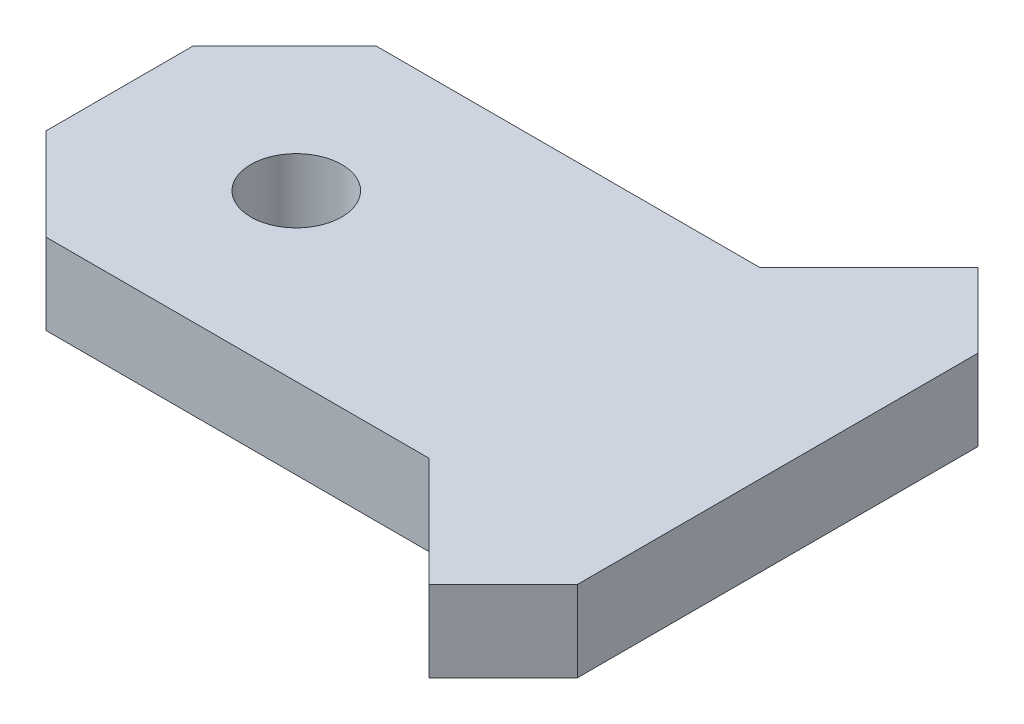
ISO-10303-21;
HEADER;
FILE_DESCRIPTION(('STEP AP214'),'2;1');
FILE_NAME('part.step','',(''),(''),'','','');
FILE_SCHEMA(('AUTOMOTIVE_DESIGN { 1 0 10303 214 1 1 1 1 }'));
ENDSEC;
DATA;
#1=APPLICATION_CONTEXT('core data for automotive mechanical design processes');
#2=APPLICATION_PROTOCOL_DEFINITION('international standard','automotive_design',2000,#1);
#3=PRODUCT_CONTEXT('',#1,'mechanical');
#4=PRODUCT('Part','Part','',(#3));
#5=PRODUCT_RELATED_PRODUCT_CATEGORY('part','',(#4));
#6=PRODUCT_DEFINITION_FORMATION('','',#4);
#7=PRODUCT_DEFINITION_CONTEXT('part definition',#1,'design');
#8=PRODUCT_DEFINITION('design','',#6,#7);
#9=PRODUCT_DEFINITION_SHAPE('','',#8);
#10=(LENGTH_UNIT() NAMED_UNIT(*) SI_UNIT(.MILLI.,.METRE.));
#11=(NAMED_UNIT(*) PLANE_ANGLE_UNIT() SI_UNIT($,.RADIAN.));
#12=(NAMED_UNIT(*) SI_UNIT($,.STERADIAN.) SOLID_ANGLE_UNIT());
#13=UNCERTAINTY_MEASURE_WITH_UNIT(LENGTH_MEASURE(1.E-05),#10,'distance_accuracy_value','');
#14=(GEOMETRIC_REPRESENTATION_CONTEXT(3) GLOBAL_UNCERTAINTY_ASSIGNED_CONTEXT((#13)) GLOBAL_UNIT_ASSIGNED_CONTEXT((#10,
#11,#12)) REPRESENTATION_CONTEXT('',''));
#15=CARTESIAN_POINT('',(0.,0.,0.));
#16=DIRECTION('',(0.,0.,1.));
#17=DIRECTION('',(1.,0.,0.));
#18=AXIS2_PLACEMENT_3D('',#15,#16,#17);
#19=CARTESIAN_POINT('',(0.,4.,0.));
#20=DIRECTION('',(0.,1.,0.));
#21=DIRECTION('',(0.,0.,1.));
#22=AXIS2_PLACEMENT_3D('',#19,#20,#21);
#23=PLANE('',#22);
#24=DIRECTION('',(-0.707106781186549,0.,0.707106781186546));
#25=VECTOR('',#24,1.);
#26=CARTESIAN_POINT('',(0.,4.,-3.62436867076458));
#27=LINE('',#26,#25);
#28=CARTESIAN_POINT('',(4.54796897923543,4.,-8.17233765));
#29=VERTEX_POINT('',#28);
#30=CARTESIAN_POINT('',(0.,4.,-3.62436867076458));
#31=VERTEX_POINT('',#30);
#32=EDGE_CURVE('E168',#29,#31,#27,.T.);
#33=ORIENTED_EDGE('',*,*,#32,.T.);
#34=DIRECTION('',(0.,0.,1.));
#35=VECTOR('',#34,1.);
#36=CARTESIAN_POINT('',(0.,4.,-3.62436867076458));
#37=LINE('',#36,#35);
#38=CARTESIAN_POINT('',(0.,4.,3.62436867076458));
#39=VERTEX_POINT('',#38);
#40=EDGE_CURVE('E104',#31,#39,#37,.T.);
#41=ORIENTED_EDGE('',*,*,#40,.T.);
#42=DIRECTION('',(0.707106781186548,0.,0.707106781186548));
#43=VECTOR('',#42,1.);
#44=CARTESIAN_POINT('',(0.,4.,3.62436867076458));
#45=LINE('',#44,#43);
#46=CARTESIAN_POINT('',(4.54796897923542,4.,8.17233765000001));
#47=VERTEX_POINT('',#46);
#48=EDGE_CURVE('E189',#39,#47,#45,.T.);
#49=ORIENTED_EDGE('',*,*,#48,.T.);
#50=DIRECTION('',(1.,0.,0.));
#51=VECTOR('',#50,1.);
#52=CARTESIAN_POINT('',(4.54796897923542,4.,8.17233765000001));
#53=LINE('',#52,#51);
#54=CARTESIAN_POINT('',(23.47528137,4.,8.17233765000001));
#55=VERTEX_POINT('',#54);
#56=EDGE_CURVE('E207',#47,#55,#53,.T.);
#57=ORIENTED_EDGE('',*,*,#56,.T.);
#58=DIRECTION('',(0.707106781186609,0.,0.707106781186486));
#59=VECTOR('',#58,1.);
#60=CARTESIAN_POINT('',(23.47528137,4.,8.17233765000001));
#61=LINE('',#60,#59);
#62=CARTESIAN_POINT('',(28.8793939163394,4.,13.5764501963394));
#63=VERTEX_POINT('',#62);
#64=EDGE_CURVE('E204',#55,#63,#61,.T.);
#65=ORIENTED_EDGE('',*,*,#64,.T.);
#66=DIRECTION('',(0.707106781186549,0.,-0.707106781186546));
#67=VECTOR('',#66,1.);
#68=CARTESIAN_POINT('',(28.8793939163394,4.,13.5764501963394));
#69=LINE('',#68,#67);
#70=CARTESIAN_POINT('',(32.5563491785094,4.,9.89949493416935));
#71=VERTEX_POINT('',#70);
#72=EDGE_CURVE('E206',#63,#71,#69,.T.);
#73=ORIENTED_EDGE('',*,*,#72,.T.);
#74=DIRECTION('',(0.,0.,-1.));
#75=VECTOR('',#74,1.);
#76=CARTESIAN_POINT('',(32.5563491785094,4.,9.89949493416935));
#77=LINE('',#76,#75);
#78=CARTESIAN_POINT('',(32.5563491785094,4.,-9.89949493416932));
#79=VERTEX_POINT('',#78);
#80=EDGE_CURVE('E129',#71,#79,#77,.T.);
#81=ORIENTED_EDGE('',*,*,#80,.T.);
#82=DIRECTION('',(-0.707106781186549,0.,-0.707106781186546));
#83=VECTOR('',#82,1.);
#84=CARTESIAN_POINT('',(32.5563491785094,4.,-9.89949493416932));
#85=LINE('',#84,#83);
#86=CARTESIAN_POINT('',(28.8793939163393,4.,-13.5764501963394));
#87=VERTEX_POINT('',#86);
#88=EDGE_CURVE('E123',#79,#87,#85,.T.);
#89=ORIENTED_EDGE('',*,*,#88,.T.);
#90=DIRECTION('',(-0.707106781186546,0.,0.707106781186549));
#91=VECTOR('',#90,1.);
#92=CARTESIAN_POINT('',(28.8793939163393,4.,-13.5764501963394));
#93=LINE('',#92,#91);
#94=CARTESIAN_POINT('',(23.47528137,4.,-8.17233765));
#95=VERTEX_POINT('',#94);
#96=EDGE_CURVE('E127',#87,#95,#93,.T.);
#97=ORIENTED_EDGE('',*,*,#96,.T.);
#98=DIRECTION('',(-1.,0.,0.));
#99=VECTOR('',#98,1.);
#100=CARTESIAN_POINT('',(4.54796897923543,4.,-8.17233765));
#101=LINE('',#100,#99);
#102=EDGE_CURVE('E56',#95,#29,#101,.T.);
#103=ORIENTED_EDGE('',*,*,#102,.T.);
#104=EDGE_LOOP('',(#33,#41,#49,#57,#65,#73,#81,#89,#97,#103));
#105=FACE_BOUND('',#104,.T.);
#106=CARTESIAN_POINT('',(8.75,4.,0.));
#107=DIRECTION('',(0.,1.,0.));
#108=DIRECTION('',(0.,0.,1.));
#109=AXIS2_PLACEMENT_3D('',#106,#107,#108);
#110=CIRCLE('',#109,2.25);
#111=CARTESIAN_POINT('',(8.75,4.,2.25));
#112=VERTEX_POINT('',#111);
#113=EDGE_CURVE('E152',#112,#112,#110,.T.);
#114=ORIENTED_EDGE('',*,*,#113,.F.);
#115=EDGE_LOOP('',(#114));
#116=FACE_BOUND('',#115,.T.);
#117=ADVANCED_FACE('F39',(#105,#116),#23,.T.);
#118=CARTESIAN_POINT('',(0.,0.,0.));
#119=DIRECTION('',(0.,1.,0.));
#120=DIRECTION('',(0.,0.,1.));
#121=AXIS2_PLACEMENT_3D('',#118,#119,#120);
#122=PLANE('',#121);
#123=DIRECTION('',(-0.707106781186549,0.,0.707106781186546));
#124=VECTOR('',#123,1.);
#125=CARTESIAN_POINT('',(0.,0.,-3.62436867076458));
#126=LINE('',#125,#124);
#127=CARTESIAN_POINT('',(4.54796897923543,0.,-8.17233765));
#128=VERTEX_POINT('',#127);
#129=CARTESIAN_POINT('',(0.,0.,-3.62436867076458));
#130=VERTEX_POINT('',#129);
#131=EDGE_CURVE('E148',#128,#130,#126,.T.);
#132=ORIENTED_EDGE('',*,*,#131,.F.);
#133=DIRECTION('',(-1.,0.,0.));
#134=VECTOR('',#133,1.);
#135=CARTESIAN_POINT('',(4.54796897923543,0.,-8.17233765));
#136=LINE('',#135,#134);
#137=CARTESIAN_POINT('',(23.47528137,0.,-8.17233765));
#138=VERTEX_POINT('',#137);
#139=EDGE_CURVE('E96',#138,#128,#136,.T.);
#140=ORIENTED_EDGE('',*,*,#139,.F.);
#141=DIRECTION('',(-0.70710678118667,0.,0.707106781186425));
#142=VECTOR('',#141,1.);
#143=CARTESIAN_POINT('',(23.47528137,0.,-8.17233765));
#144=LINE('',#143,#142);
#145=CARTESIAN_POINT('',(28.8793939163393,0.,-13.5764501963394));
#146=VERTEX_POINT('',#145);
#147=EDGE_CURVE('E90',#146,#138,#144,.T.);
#148=ORIENTED_EDGE('',*,*,#147,.F.);
#149=DIRECTION('',(-0.707106781186549,0.,-0.707106781186546));
#150=VECTOR('',#149,1.);
#151=CARTESIAN_POINT('',(32.5563491785094,0.,-9.89949493416932));
#152=LINE('',#151,#150);
#153=CARTESIAN_POINT('',(32.5563491785094,0.,-9.89949493416932));
#154=VERTEX_POINT('',#153);
#155=EDGE_CURVE('E138',#154,#146,#152,.T.);
#156=ORIENTED_EDGE('',*,*,#155,.F.);
#157=DIRECTION('',(0.,0.,-1.));
#158=VECTOR('',#157,1.);
#159=CARTESIAN_POINT('',(32.5563491785094,0.,9.89949493416935));
#160=LINE('',#159,#158);
#161=CARTESIAN_POINT('',(32.5563491785094,0.,9.89949493416935));
#162=VERTEX_POINT('',#161);
#163=EDGE_CURVE('E163',#162,#154,#160,.T.);
#164=ORIENTED_EDGE('',*,*,#163,.F.);
#165=DIRECTION('',(0.707106781186549,0.,-0.707106781186546));
#166=VECTOR('',#165,1.);
#167=CARTESIAN_POINT('',(28.8793939163394,0.,13.5764501963394));
#168=LINE('',#167,#166);
#169=CARTESIAN_POINT('',(28.8793939163394,0.,13.5764501963394));
#170=VERTEX_POINT('',#169);
#171=EDGE_CURVE('E161',#170,#162,#168,.T.);
#172=ORIENTED_EDGE('',*,*,#171,.F.);
#173=DIRECTION('',(0.707106781186546,0.,0.707106781186549));
#174=VECTOR('',#173,1.);
#175=CARTESIAN_POINT('',(24.05294372,0.,8.74999999999999));
#176=LINE('',#175,#174);
#177=CARTESIAN_POINT('',(23.47528137,0.,8.17233765000001));
#178=VERTEX_POINT('',#177);
#179=EDGE_CURVE('E159',#178,#170,#176,.T.);
#180=ORIENTED_EDGE('',*,*,#179,.F.);
#181=DIRECTION('',(1.,0.,0.));
#182=VECTOR('',#181,1.);
#183=CARTESIAN_POINT('',(4.54796897923542,0.,8.17233765000001));
#184=LINE('',#183,#182);
#185=CARTESIAN_POINT('',(4.54796897923542,0.,8.17233765000001));
#186=VERTEX_POINT('',#185);
#187=EDGE_CURVE('E156',#186,#178,#184,.T.);
#188=ORIENTED_EDGE('',*,*,#187,.F.);
#189=DIRECTION('',(0.707106781186548,0.,0.707106781186548));
#190=VECTOR('',#189,1.);
#191=CARTESIAN_POINT('',(0.,0.,3.62436867076458));
#192=LINE('',#191,#190);
#193=CARTESIAN_POINT('',(0.,0.,3.62436867076458));
#194=VERTEX_POINT('',#193);
#195=EDGE_CURVE('E154',#194,#186,#192,.T.);
#196=ORIENTED_EDGE('',*,*,#195,.F.);
#197=DIRECTION('',(0.,0.,1.));
#198=VECTOR('',#197,1.);
#199=CARTESIAN_POINT('',(0.,0.,-3.62436867076458));
#200=LINE('',#199,#198);
#201=EDGE_CURVE('E151',#130,#194,#200,.T.);
#202=ORIENTED_EDGE('',*,*,#201,.F.);
#203=EDGE_LOOP('',(#132,#140,#148,#156,#164,#172,#180,#188,#196,#202));
#204=FACE_BOUND('',#203,.T.);
#205=CARTESIAN_POINT('',(8.75,0.,0.));
#206=DIRECTION('',(0.,1.,0.));
#207=DIRECTION('',(0.,0.,1.));
#208=AXIS2_PLACEMENT_3D('',#205,#206,#207);
#209=CIRCLE('',#208,2.25);
#210=CARTESIAN_POINT('',(8.75,0.,2.25));
#211=VERTEX_POINT('',#210);
#212=EDGE_CURVE('E215',#211,#211,#209,.T.);
#213=ORIENTED_EDGE('',*,*,#212,.T.);
#214=EDGE_LOOP('',(#213));
#215=FACE_BOUND('',#214,.T.);
#216=ADVANCED_FACE('F193',(#204,#215),#122,.F.);
#217=CARTESIAN_POINT('',(0.,4.,-3.62436867076458));
#218=DIRECTION('',(0.707106781186546,0.,0.707106781186549));
#219=DIRECTION('',(0.707106781186549,0.,-0.707106781186546));
#220=AXIS2_PLACEMENT_3D('',#217,#218,#219);
#221=PLANE('',#220);
#222=ORIENTED_EDGE('',*,*,#131,.T.);
#223=DIRECTION('',(0.,-1.,0.));
#224=VECTOR('',#223,1.);
#225=CARTESIAN_POINT('',(0.,4.,-3.62436867076458));
#226=LINE('',#225,#224);
#227=EDGE_CURVE('E11',#31,#130,#226,.T.);
#228=ORIENTED_EDGE('',*,*,#227,.F.);
#229=ORIENTED_EDGE('',*,*,#32,.F.);
#230=DIRECTION('',(0.,-1.,0.));
#231=VECTOR('',#230,1.);
#232=CARTESIAN_POINT('',(4.54796897923543,4.,-8.17233765));
#233=LINE('',#232,#231);
#234=EDGE_CURVE('E144',#29,#128,#233,.T.);
#235=ORIENTED_EDGE('',*,*,#234,.T.);
#236=EDGE_LOOP('',(#222,#228,#229,#235));
#237=FACE_BOUND('',#236,.T.);
#238=ADVANCED_FACE('F41',(#237),#221,.F.);
#239=CARTESIAN_POINT('',(0.,4.,-3.62436867076458));
#240=DIRECTION('',(1.,0.,0.));
#241=DIRECTION('',(0.,0.,-1.));
#242=AXIS2_PLACEMENT_3D('',#239,#240,#241);
#243=PLANE('',#242);
#244=ORIENTED_EDGE('',*,*,#201,.T.);
#245=DIRECTION('',(0.,-1.,0.));
#246=VECTOR('',#245,1.);
#247=CARTESIAN_POINT('',(0.,4.,3.62436867076458));
#248=LINE('',#247,#246);
#249=EDGE_CURVE('E48',#39,#194,#248,.T.);
#250=ORIENTED_EDGE('',*,*,#249,.F.);
#251=ORIENTED_EDGE('',*,*,#40,.F.);
#252=ORIENTED_EDGE('',*,*,#227,.T.);
#253=EDGE_LOOP('',(#244,#250,#251,#252));
#254=FACE_BOUND('',#253,.T.);
#255=ADVANCED_FACE('F251',(#254),#243,.F.);
#256=CARTESIAN_POINT('',(0.,4.,3.62436867076458));
#257=DIRECTION('',(0.707106781186547,0.,-0.707106781186547));
#258=DIRECTION('',(-0.707106781186548,0.,-0.707106781186548));
#259=AXIS2_PLACEMENT_3D('',#256,#257,#258);
#260=PLANE('',#259);
#261=ORIENTED_EDGE('',*,*,#195,.T.);
#262=DIRECTION('',(0.,-1.,0.));
#263=VECTOR('',#262,1.);
#264=CARTESIAN_POINT('',(4.54796897923542,4.,8.17233765000001));
#265=LINE('',#264,#263);
#266=EDGE_CURVE('E181',#47,#186,#265,.T.);
#267=ORIENTED_EDGE('',*,*,#266,.F.);
#268=ORIENTED_EDGE('',*,*,#48,.F.);
#269=ORIENTED_EDGE('',*,*,#249,.T.);
#270=EDGE_LOOP('',(#261,#267,#268,#269));
#271=FACE_BOUND('',#270,.T.);
#272=ADVANCED_FACE('F187',(#271),#260,.F.);
#273=CARTESIAN_POINT('',(4.54796897923542,4.,8.17233765000001));
#274=DIRECTION('',(0.,0.,-1.));
#275=DIRECTION('',(-1.,0.,0.));
#276=AXIS2_PLACEMENT_3D('',#273,#274,#275);
#277=PLANE('',#276);
#278=ORIENTED_EDGE('',*,*,#187,.T.);
#279=DIRECTION('',(0.,-1.,0.));
#280=VECTOR('',#279,1.);
#281=CARTESIAN_POINT('',(23.47528137,4.,8.17233765000001));
#282=LINE('',#281,#280);
#283=EDGE_CURVE('E178',#55,#178,#282,.T.);
#284=ORIENTED_EDGE('',*,*,#283,.F.);
#285=ORIENTED_EDGE('',*,*,#56,.F.);
#286=ORIENTED_EDGE('',*,*,#266,.T.);
#287=EDGE_LOOP('',(#278,#284,#285,#286));
#288=FACE_BOUND('',#287,.T.);
#289=ADVANCED_FACE('F198',(#288),#277,.F.);
#290=CARTESIAN_POINT('',(24.05294372,4.,8.74999999999999));
#291=DIRECTION('',(0.707106781186549,0.,-0.707106781186546));
#292=DIRECTION('',(-0.707106781186546,0.,-0.707106781186549));
#293=AXIS2_PLACEMENT_3D('',#290,#291,#292);
#294=PLANE('',#293);
#295=ORIENTED_EDGE('',*,*,#179,.T.);
#296=DIRECTION('',(0.,-1.,0.));
#297=VECTOR('',#296,1.);
#298=CARTESIAN_POINT('',(28.8793939163394,4.,13.5764501963394));
#299=LINE('',#298,#297);
#300=EDGE_CURVE('E175',#63,#170,#299,.T.);
#301=ORIENTED_EDGE('',*,*,#300,.F.);
#302=ORIENTED_EDGE('',*,*,#64,.F.);
#303=ORIENTED_EDGE('',*,*,#283,.T.);
#304=EDGE_LOOP('',(#295,#301,#302,#303));
#305=FACE_BOUND('',#304,.T.);
#306=ADVANCED_FACE('F202',(#305),#294,.F.);
#307=CARTESIAN_POINT('',(28.8793939163394,4.,13.5764501963394));
#308=DIRECTION('',(-0.707106781186546,0.,-0.707106781186549));
#309=DIRECTION('',(-0.707106781186549,0.,0.707106781186546));
#310=AXIS2_PLACEMENT_3D('',#307,#308,#309);
#311=PLANE('',#310);
#312=ORIENTED_EDGE('',*,*,#171,.T.);
#313=DIRECTION('',(0.,-1.,0.));
#314=VECTOR('',#313,1.);
#315=CARTESIAN_POINT('',(32.5563491785094,4.,9.89949493416935));
#316=LINE('',#315,#314);
#317=EDGE_CURVE('E172',#71,#162,#316,.T.);
#318=ORIENTED_EDGE('',*,*,#317,.F.);
#319=ORIENTED_EDGE('',*,*,#72,.F.);
#320=ORIENTED_EDGE('',*,*,#300,.T.);
#321=EDGE_LOOP('',(#312,#318,#319,#320));
#322=FACE_BOUND('',#321,.T.);
#323=ADVANCED_FACE('F241',(#322),#311,.F.);
#324=CARTESIAN_POINT('',(32.5563491785094,4.,9.89949493416935));
#325=DIRECTION('',(-1.,0.,0.));
#326=DIRECTION('',(0.,0.,1.));
#327=AXIS2_PLACEMENT_3D('',#324,#325,#326);
#328=PLANE('',#327);
#329=ORIENTED_EDGE('',*,*,#163,.T.);
#330=DIRECTION('',(0.,-1.,0.));
#331=VECTOR('',#330,1.);
#332=CARTESIAN_POINT('',(32.5563491785094,4.,-9.89949493416932));
#333=LINE('',#332,#331);
#334=EDGE_CURVE('E139',#79,#154,#333,.T.);
#335=ORIENTED_EDGE('',*,*,#334,.F.);
#336=ORIENTED_EDGE('',*,*,#80,.F.);
#337=ORIENTED_EDGE('',*,*,#317,.T.);
#338=EDGE_LOOP('',(#329,#335,#336,#337));
#339=FACE_BOUND('',#338,.T.);
#340=ADVANCED_FACE('F238',(#339),#328,.F.);
#341=CARTESIAN_POINT('',(32.5563491785094,4.,-9.89949493416932));
#342=DIRECTION('',(-0.707106781186546,0.,0.707106781186549));
#343=DIRECTION('',(0.707106781186549,0.,0.707106781186546));
#344=AXIS2_PLACEMENT_3D('',#341,#342,#343);
#345=PLANE('',#344);
#346=ORIENTED_EDGE('',*,*,#155,.T.);
#347=DIRECTION('',(0.,-1.,0.));
#348=VECTOR('',#347,1.);
#349=CARTESIAN_POINT('',(28.8793939163393,4.,-13.5764501963394));
#350=LINE('',#349,#348);
#351=EDGE_CURVE('E135',#87,#146,#350,.T.);
#352=ORIENTED_EDGE('',*,*,#351,.F.);
#353=ORIENTED_EDGE('',*,*,#88,.F.);
#354=ORIENTED_EDGE('',*,*,#334,.T.);
#355=EDGE_LOOP('',(#346,#352,#353,#354));
#356=FACE_BOUND('',#355,.T.);
#357=ADVANCED_FACE('F136',(#356),#345,.F.);
#358=CARTESIAN_POINT('',(23.47528137,4.,-8.17233765));
#359=DIRECTION('',(0.707106781186425,0.,0.70710678118667));
#360=DIRECTION('',(0.70710678118667,0.,-0.707106781186425));
#361=AXIS2_PLACEMENT_3D('',#358,#359,#360);
#362=PLANE('',#361);
#363=ORIENTED_EDGE('',*,*,#147,.T.);
#364=DIRECTION('',(0.,-1.,0.));
#365=VECTOR('',#364,1.);
#366=CARTESIAN_POINT('',(23.47528137,4.,-8.17233765));
#367=LINE('',#366,#365);
#368=EDGE_CURVE('E140',#95,#138,#367,.T.);
#369=ORIENTED_EDGE('',*,*,#368,.F.);
#370=ORIENTED_EDGE('',*,*,#96,.F.);
#371=ORIENTED_EDGE('',*,*,#351,.T.);
#372=EDGE_LOOP('',(#363,#369,#370,#371));
#373=FACE_BOUND('',#372,.T.);
#374=ADVANCED_FACE('F142',(#373),#362,.F.);
#375=CARTESIAN_POINT('',(4.54796897923543,4.,-8.17233765));
#376=DIRECTION('',(0.,0.,1.));
#377=DIRECTION('',(1.,0.,0.));
#378=AXIS2_PLACEMENT_3D('',#375,#376,#377);
#379=PLANE('',#378);
#380=ORIENTED_EDGE('',*,*,#139,.T.);
#381=ORIENTED_EDGE('',*,*,#234,.F.);
#382=ORIENTED_EDGE('',*,*,#102,.F.);
#383=ORIENTED_EDGE('',*,*,#368,.T.);
#384=EDGE_LOOP('',(#380,#381,#382,#383));
#385=FACE_BOUND('',#384,.T.);
#386=ADVANCED_FACE('F231',(#385),#379,.F.);
#387=CARTESIAN_POINT('',(8.75,4.,0.));
#388=DIRECTION('',(0.,-1.,0.));
#389=DIRECTION('',(0.,0.,-1.));
#390=AXIS2_PLACEMENT_3D('',#387,#388,#389);
#391=CYLINDRICAL_SURFACE('',#390,2.25);
#392=ORIENTED_EDGE('',*,*,#113,.T.);
#393=EDGE_LOOP('',(#392));
#394=FACE_BOUND('',#393,.T.);
#395=ORIENTED_EDGE('',*,*,#212,.F.);
#396=EDGE_LOOP('',(#395));
#397=FACE_BOUND('',#396,.T.);
#398=ADVANCED_FACE('F221',(#394,#397),#391,.F.);
#399=CLOSED_SHELL('',(#117,#216,#238,#255,#272,#289,#306,#323,#340,#357,#374,#386,#398));
#400=MANIFOLD_SOLID_BREP('B2',#399);
#401=ADVANCED_BREP_SHAPE_REPRESENTATION('',(#18,#400),#14);
#402=SHAPE_DEFINITION_REPRESENTATION(#9,#401);
ENDSEC;
END-ISO-10303-21;
